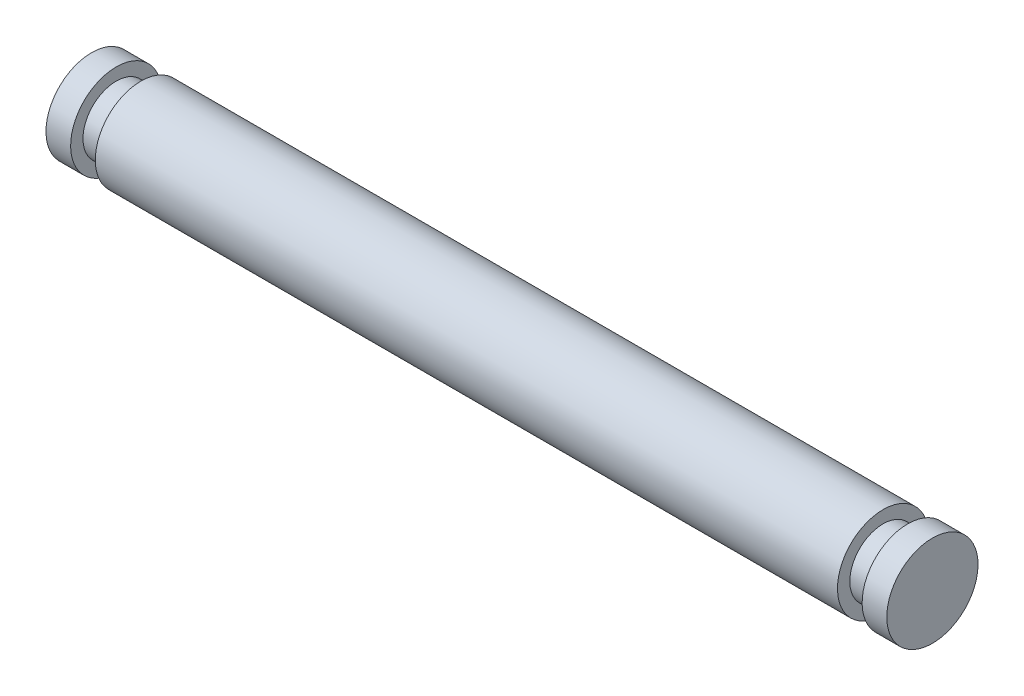
ISO-10303-21;
HEADER;
FILE_DESCRIPTION(('STEP AP214'),'2;1');
FILE_NAME('part.step','',(''),(''),'','','');
FILE_SCHEMA(('AUTOMOTIVE_DESIGN { 1 0 10303 214 1 1 1 1 }'));
ENDSEC;
DATA;
#1=APPLICATION_CONTEXT('core data for automotive mechanical design processes');
#2=APPLICATION_PROTOCOL_DEFINITION('international standard','automotive_design',2000,#1);
#3=PRODUCT_CONTEXT('',#1,'mechanical');
#4=PRODUCT('Part','Part','',(#3));
#5=PRODUCT_RELATED_PRODUCT_CATEGORY('part','',(#4));
#6=PRODUCT_DEFINITION_FORMATION('','',#4);
#7=PRODUCT_DEFINITION_CONTEXT('part definition',#1,'design');
#8=PRODUCT_DEFINITION('design','',#6,#7);
#9=PRODUCT_DEFINITION_SHAPE('','',#8);
#10=(LENGTH_UNIT() NAMED_UNIT(*) SI_UNIT(.MILLI.,.METRE.));
#11=(NAMED_UNIT(*) PLANE_ANGLE_UNIT() SI_UNIT($,.RADIAN.));
#12=(NAMED_UNIT(*) SI_UNIT($,.STERADIAN.) SOLID_ANGLE_UNIT());
#13=UNCERTAINTY_MEASURE_WITH_UNIT(LENGTH_MEASURE(1.E-05),#10,'distance_accuracy_value','');
#14=(GEOMETRIC_REPRESENTATION_CONTEXT(3) GLOBAL_UNCERTAINTY_ASSIGNED_CONTEXT((#13)) GLOBAL_UNIT_ASSIGNED_CONTEXT((#10,
#11,#12)) REPRESENTATION_CONTEXT('',''));
#15=CARTESIAN_POINT('',(0.,0.,0.));
#16=DIRECTION('',(0.,0.,1.));
#17=DIRECTION('',(1.,0.,0.));
#18=AXIS2_PLACEMENT_3D('',#15,#16,#17);
#19=CARTESIAN_POINT('',(-30.1,-1.,0.));
#20=DIRECTION('',(-1.,0.,0.));
#21=DIRECTION('',(0.,-1.,0.));
#22=AXIS2_PLACEMENT_3D('',#19,#20,#21);
#23=PLANE('',#22);
#24=CARTESIAN_POINT('',(-30.1,-3.7,0.));
#25=DIRECTION('',(1.,0.,0.));
#26=DIRECTION('',(0.,1.,0.));
#27=AXIS2_PLACEMENT_3D('',#24,#25,#26);
#28=CIRCLE('',#27,2.7);
#29=CARTESIAN_POINT('',(-30.1,-1.,0.));
#30=VERTEX_POINT('',#29);
#31=EDGE_CURVE('E80',#30,#30,#28,.T.);
#32=ORIENTED_EDGE('',*,*,#31,.T.);
#33=EDGE_LOOP('',(#32));
#34=FACE_BOUND('',#33,.T.);
#35=CARTESIAN_POINT('',(-30.1,-3.7,0.));
#36=DIRECTION('',(1.,0.,0.));
#37=DIRECTION('',(0.,1.,0.));
#38=AXIS2_PLACEMENT_3D('',#35,#36,#37);
#39=CIRCLE('',#38,3.7);
#40=CARTESIAN_POINT('',(-30.1,0.,0.));
#41=VERTEX_POINT('',#40);
#42=EDGE_CURVE('E10',#41,#41,#39,.T.);
#43=ORIENTED_EDGE('',*,*,#42,.F.);
#44=EDGE_LOOP('',(#43));
#45=FACE_BOUND('',#44,.T.);
#46=ADVANCED_FACE('F37',(#34,#45),#23,.T.);
#47=CARTESIAN_POINT('',(34.1,-3.69999999999999,0.));
#48=DIRECTION('',(1.,0.,0.));
#49=DIRECTION('',(0.,1.,0.));
#50=AXIS2_PLACEMENT_3D('',#47,#48,#49);
#51=CYLINDRICAL_SURFACE('',#50,3.7);
#52=ORIENTED_EDGE('',*,*,#42,.T.);
#53=EDGE_LOOP('',(#52));
#54=FACE_BOUND('',#53,.T.);
#55=CARTESIAN_POINT('',(30.1,-3.69999999999999,0.));
#56=DIRECTION('',(1.,0.,0.));
#57=DIRECTION('',(0.,1.,0.));
#58=AXIS2_PLACEMENT_3D('',#55,#56,#57);
#59=CIRCLE('',#58,3.7);
#60=CARTESIAN_POINT('',(30.1,0.,0.));
#61=VERTEX_POINT('',#60);
#62=EDGE_CURVE('E44',#61,#61,#59,.T.);
#63=ORIENTED_EDGE('',*,*,#62,.F.);
#64=EDGE_LOOP('',(#63));
#65=FACE_BOUND('',#64,.T.);
#66=ADVANCED_FACE('F99',(#54,#65),#51,.T.);
#67=CARTESIAN_POINT('',(30.1,0.,0.));
#68=DIRECTION('',(1.,0.,0.));
#69=DIRECTION('',(0.,1.,0.));
#70=AXIS2_PLACEMENT_3D('',#67,#68,#69);
#71=PLANE('',#70);
#72=ORIENTED_EDGE('',*,*,#62,.T.);
#73=EDGE_LOOP('',(#72));
#74=FACE_BOUND('',#73,.T.);
#75=CARTESIAN_POINT('',(30.1,-3.69999999999999,0.));
#76=DIRECTION('',(1.,0.,0.));
#77=DIRECTION('',(0.,1.,0.));
#78=AXIS2_PLACEMENT_3D('',#75,#76,#77);
#79=CIRCLE('',#78,2.7);
#80=CARTESIAN_POINT('',(30.1,-0.999999999999989,0.));
#81=VERTEX_POINT('',#80);
#82=EDGE_CURVE('E49',#81,#81,#79,.T.);
#83=ORIENTED_EDGE('',*,*,#82,.F.);
#84=EDGE_LOOP('',(#83));
#85=FACE_BOUND('',#84,.T.);
#86=ADVANCED_FACE('F103',(#74,#85),#71,.T.);
#87=CARTESIAN_POINT('',(34.1,-3.69999999999999,0.));
#88=DIRECTION('',(1.,0.,0.));
#89=DIRECTION('',(0.,1.,0.));
#90=AXIS2_PLACEMENT_3D('',#87,#88,#89);
#91=CYLINDRICAL_SURFACE('',#90,2.7);
#92=ORIENTED_EDGE('',*,*,#82,.T.);
#93=EDGE_LOOP('',(#92));
#94=FACE_BOUND('',#93,.T.);
#95=CARTESIAN_POINT('',(32.1,-3.69999999999999,0.));
#96=DIRECTION('',(1.,0.,0.));
#97=DIRECTION('',(0.,1.,0.));
#98=AXIS2_PLACEMENT_3D('',#95,#96,#97);
#99=CIRCLE('',#98,2.7);
#100=CARTESIAN_POINT('',(32.1,-0.999999999999988,0.));
#101=VERTEX_POINT('',#100);
#102=EDGE_CURVE('E54',#101,#101,#99,.T.);
#103=ORIENTED_EDGE('',*,*,#102,.F.);
#104=EDGE_LOOP('',(#103));
#105=FACE_BOUND('',#104,.T.);
#106=ADVANCED_FACE('F107',(#94,#105),#91,.T.);
#107=CARTESIAN_POINT('',(32.1,-0.999999999999988,0.));
#108=DIRECTION('',(-1.,0.,0.));
#109=DIRECTION('',(0.,-1.,0.));
#110=AXIS2_PLACEMENT_3D('',#107,#108,#109);
#111=PLANE('',#110);
#112=ORIENTED_EDGE('',*,*,#102,.T.);
#113=EDGE_LOOP('',(#112));
#114=FACE_BOUND('',#113,.T.);
#115=CARTESIAN_POINT('',(32.1,-3.69999999999999,0.));
#116=DIRECTION('',(1.,0.,0.));
#117=DIRECTION('',(0.,1.,0.));
#118=AXIS2_PLACEMENT_3D('',#115,#116,#117);
#119=CIRCLE('',#118,3.7);
#120=CARTESIAN_POINT('',(32.1,0.,0.));
#121=VERTEX_POINT('',#120);
#122=EDGE_CURVE('E60',#121,#121,#119,.T.);
#123=ORIENTED_EDGE('',*,*,#122,.F.);
#124=EDGE_LOOP('',(#123));
#125=FACE_BOUND('',#124,.T.);
#126=ADVANCED_FACE('F113',(#114,#125),#111,.T.);
#127=CARTESIAN_POINT('',(34.1,-3.69999999999999,0.));
#128=DIRECTION('',(1.,0.,0.));
#129=DIRECTION('',(0.,1.,0.));
#130=AXIS2_PLACEMENT_3D('',#127,#128,#129);
#131=CYLINDRICAL_SURFACE('',#130,3.7);
#132=ORIENTED_EDGE('',*,*,#122,.T.);
#133=EDGE_LOOP('',(#132));
#134=FACE_BOUND('',#133,.T.);
#135=CARTESIAN_POINT('',(34.1,-3.69999999999999,0.));
#136=DIRECTION('',(1.,0.,0.));
#137=DIRECTION('',(0.,1.,0.));
#138=AXIS2_PLACEMENT_3D('',#135,#136,#137);
#139=CIRCLE('',#138,3.7);
#140=CARTESIAN_POINT('',(34.1,0.,0.));
#141=VERTEX_POINT('',#140);
#142=EDGE_CURVE('E64',#141,#141,#139,.T.);
#143=ORIENTED_EDGE('',*,*,#142,.F.);
#144=EDGE_LOOP('',(#143));
#145=FACE_BOUND('',#144,.T.);
#146=ADVANCED_FACE('F117',(#134,#145),#131,.T.);
#147=CARTESIAN_POINT('',(34.1,0.,0.));
#148=DIRECTION('',(1.,0.,0.));
#149=DIRECTION('',(0.,1.,0.));
#150=AXIS2_PLACEMENT_3D('',#147,#148,#149);
#151=PLANE('',#150);
#152=ORIENTED_EDGE('',*,*,#142,.T.);
#153=EDGE_LOOP('',(#152));
#154=FACE_BOUND('',#153,.T.);
#155=ADVANCED_FACE('F121',(#154),#151,.T.);
#156=CARTESIAN_POINT('',(-34.1,-3.7,0.));
#157=DIRECTION('',(-1.,0.,0.));
#158=DIRECTION('',(0.,-1.,0.));
#159=AXIS2_PLACEMENT_3D('',#156,#157,#158);
#160=PLANE('',#159);
#161=CARTESIAN_POINT('',(-34.1,-3.7,0.));
#162=DIRECTION('',(1.,0.,0.));
#163=DIRECTION('',(0.,1.,0.));
#164=AXIS2_PLACEMENT_3D('',#161,#162,#163);
#165=CIRCLE('',#164,3.7);
#166=CARTESIAN_POINT('',(-34.1,0.,0.));
#167=VERTEX_POINT('',#166);
#168=EDGE_CURVE('E68',#167,#167,#165,.T.);
#169=ORIENTED_EDGE('',*,*,#168,.F.);
#170=EDGE_LOOP('',(#169));
#171=FACE_BOUND('',#170,.T.);
#172=ADVANCED_FACE('F125',(#171),#160,.T.);
#173=CARTESIAN_POINT('',(34.1,-3.69999999999999,0.));
#174=DIRECTION('',(1.,0.,0.));
#175=DIRECTION('',(0.,1.,0.));
#176=AXIS2_PLACEMENT_3D('',#173,#174,#175);
#177=CYLINDRICAL_SURFACE('',#176,3.7);
#178=ORIENTED_EDGE('',*,*,#168,.T.);
#179=EDGE_LOOP('',(#178));
#180=FACE_BOUND('',#179,.T.);
#181=CARTESIAN_POINT('',(-32.1,-3.7,0.));
#182=DIRECTION('',(1.,0.,0.));
#183=DIRECTION('',(0.,1.,0.));
#184=AXIS2_PLACEMENT_3D('',#181,#182,#183);
#185=CIRCLE('',#184,3.7);
#186=CARTESIAN_POINT('',(-32.1,0.,0.));
#187=VERTEX_POINT('',#186);
#188=EDGE_CURVE('E72',#187,#187,#185,.T.);
#189=ORIENTED_EDGE('',*,*,#188,.F.);
#190=EDGE_LOOP('',(#189));
#191=FACE_BOUND('',#190,.T.);
#192=ADVANCED_FACE('F95',(#180,#191),#177,.T.);
#193=CARTESIAN_POINT('',(-32.1,0.,0.));
#194=DIRECTION('',(1.,0.,0.));
#195=DIRECTION('',(0.,1.,0.));
#196=AXIS2_PLACEMENT_3D('',#193,#194,#195);
#197=PLANE('',#196);
#198=ORIENTED_EDGE('',*,*,#188,.T.);
#199=EDGE_LOOP('',(#198));
#200=FACE_BOUND('',#199,.T.);
#201=CARTESIAN_POINT('',(-32.1,-3.7,0.));
#202=DIRECTION('',(1.,0.,0.));
#203=DIRECTION('',(0.,1.,0.));
#204=AXIS2_PLACEMENT_3D('',#201,#202,#203);
#205=CIRCLE('',#204,2.7);
#206=CARTESIAN_POINT('',(-32.1,-1.,0.));
#207=VERTEX_POINT('',#206);
#208=EDGE_CURVE('E76',#207,#207,#205,.T.);
#209=ORIENTED_EDGE('',*,*,#208,.F.);
#210=EDGE_LOOP('',(#209));
#211=FACE_BOUND('',#210,.T.);
#212=ADVANCED_FACE('F89',(#200,#211),#197,.T.);
#213=CARTESIAN_POINT('',(34.1,-3.69999999999999,0.));
#214=DIRECTION('',(1.,0.,0.));
#215=DIRECTION('',(0.,1.,0.));
#216=AXIS2_PLACEMENT_3D('',#213,#214,#215);
#217=CYLINDRICAL_SURFACE('',#216,2.7);
#218=ORIENTED_EDGE('',*,*,#208,.T.);
#219=EDGE_LOOP('',(#218));
#220=FACE_BOUND('',#219,.T.);
#221=ORIENTED_EDGE('',*,*,#31,.F.);
#222=EDGE_LOOP('',(#221));
#223=FACE_BOUND('',#222,.T.);
#224=ADVANCED_FACE('F87',(#220,#223),#217,.T.);
#225=CLOSED_SHELL('',(#46,#66,#86,#106,#126,#146,#155,#172,#192,#212,#224));
#226=MANIFOLD_SOLID_BREP('B2',#225);
#227=ADVANCED_BREP_SHAPE_REPRESENTATION('',(#18,#226),#14);
#228=SHAPE_DEFINITION_REPRESENTATION(#9,#227);
ENDSEC;
END-ISO-10303-21;
